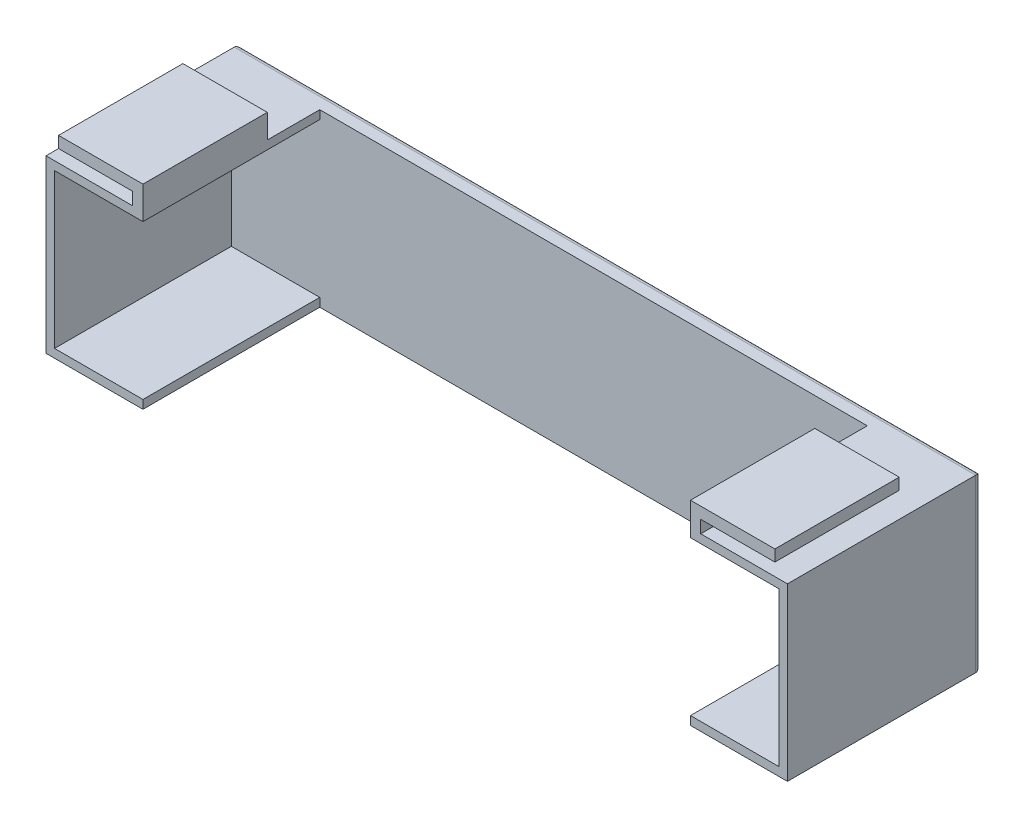
ISO-10303-21;
HEADER;
FILE_DESCRIPTION(('STEP AP214'),'2;1');
FILE_NAME('part.step','',(''),(''),'','','');
FILE_SCHEMA(('AUTOMOTIVE_DESIGN { 1 0 10303 214 1 1 1 1 }'));
ENDSEC;
DATA;
#1=APPLICATION_CONTEXT('core data for automotive mechanical design processes');
#2=APPLICATION_PROTOCOL_DEFINITION('international standard','automotive_design',2000,#1);
#3=PRODUCT_CONTEXT('',#1,'mechanical');
#4=PRODUCT('Part','Part','',(#3));
#5=PRODUCT_RELATED_PRODUCT_CATEGORY('part','',(#4));
#6=PRODUCT_DEFINITION_FORMATION('','',#4);
#7=PRODUCT_DEFINITION_CONTEXT('part definition',#1,'design');
#8=PRODUCT_DEFINITION('design','',#6,#7);
#9=PRODUCT_DEFINITION_SHAPE('','',#8);
#10=(LENGTH_UNIT() NAMED_UNIT(*) SI_UNIT(.MILLI.,.METRE.));
#11=(NAMED_UNIT(*) PLANE_ANGLE_UNIT() SI_UNIT($,.RADIAN.));
#12=(NAMED_UNIT(*) SI_UNIT($,.STERADIAN.) SOLID_ANGLE_UNIT());
#13=UNCERTAINTY_MEASURE_WITH_UNIT(LENGTH_MEASURE(1.E-05),#10,'distance_accuracy_value','');
#14=(GEOMETRIC_REPRESENTATION_CONTEXT(3) GLOBAL_UNCERTAINTY_ASSIGNED_CONTEXT((#13)) GLOBAL_UNIT_ASSIGNED_CONTEXT((#10,
#11,#12)) REPRESENTATION_CONTEXT('',''));
#15=CARTESIAN_POINT('',(0.,0.,0.));
#16=DIRECTION('',(0.,0.,1.));
#17=DIRECTION('',(1.,0.,0.));
#18=AXIS2_PLACEMENT_3D('',#15,#16,#17);
#19=CARTESIAN_POINT('',(0.,30.,1.));
#20=DIRECTION('',(0.,-1.,0.));
#21=DIRECTION('',(0.,0.,-1.));
#22=AXIS2_PLACEMENT_3D('',#19,#20,#21);
#23=PLANE('',#22);
#24=DIRECTION('',(0.,0.,-1.));
#25=VECTOR('',#24,1.);
#26=CARTESIAN_POINT('',(130.,30.,1.));
#27=LINE('',#26,#25);
#28=CARTESIAN_POINT('',(130.,30.,32.));
#29=VERTEX_POINT('',#28);
#30=CARTESIAN_POINT('',(130.,30.,-1.));
#31=VERTEX_POINT('',#30);
#32=EDGE_CURVE('E297',#29,#31,#27,.T.);
#33=ORIENTED_EDGE('',*,*,#32,.T.);
#34=DIRECTION('',(1.,0.,0.));
#35=VECTOR('',#34,1.);
#36=CARTESIAN_POINT('',(0.,30.,-1.));
#37=LINE('',#36,#35);
#38=CARTESIAN_POINT('',(0.,30.,-1.));
#39=VERTEX_POINT('',#38);
#40=EDGE_CURVE('E271',#31,#39,#37,.F.);
#41=ORIENTED_EDGE('',*,*,#40,.T.);
#42=DIRECTION('',(0.,0.,-1.));
#43=VECTOR('',#42,1.);
#44=CARTESIAN_POINT('',(0.,30.,1.));
#45=LINE('',#44,#43);
#46=CARTESIAN_POINT('',(0.,30.,32.));
#47=VERTEX_POINT('',#46);
#48=EDGE_CURVE('E306',#47,#39,#45,.T.);
#49=ORIENTED_EDGE('',*,*,#48,.F.);
#50=DIRECTION('',(-1.,0.,0.));
#51=VECTOR('',#50,1.);
#52=CARTESIAN_POINT('',(17.,30.,32.));
#53=LINE('',#52,#51);
#54=CARTESIAN_POINT('',(15.2,30.,32.));
#55=VERTEX_POINT('',#54);
#56=EDGE_CURVE('E530',#55,#47,#53,.T.);
#57=ORIENTED_EDGE('',*,*,#56,.F.);
#58=DIRECTION('',(0.,0.,1.));
#59=VECTOR('',#58,1.);
#60=CARTESIAN_POINT('',(15.2,30.,32.));
#61=LINE('',#60,#59);
#62=CARTESIAN_POINT('',(15.2,30.,10.2));
#63=VERTEX_POINT('',#62);
#64=EDGE_CURVE('E462',#63,#55,#61,.T.);
#65=ORIENTED_EDGE('',*,*,#64,.F.);
#66=DIRECTION('',(-1.,0.,0.));
#67=VECTOR('',#66,1.);
#68=CARTESIAN_POINT('',(17.,30.,10.2));
#69=LINE('',#68,#67);
#70=CARTESIAN_POINT('',(17.,30.,10.2));
#71=VERTEX_POINT('',#70);
#72=EDGE_CURVE('E454',#71,#63,#69,.T.);
#73=ORIENTED_EDGE('',*,*,#72,.F.);
#74=DIRECTION('',(0.,0.,-1.));
#75=VECTOR('',#74,1.);
#76=CARTESIAN_POINT('',(17.,30.,32.));
#77=LINE('',#76,#75);
#78=CARTESIAN_POINT('',(17.,30.,1.));
#79=VERTEX_POINT('',#78);
#80=EDGE_CURVE('E548',#71,#79,#77,.T.);
#81=ORIENTED_EDGE('',*,*,#80,.T.);
#82=DIRECTION('',(-1.,0.,0.));
#83=VECTOR('',#82,1.);
#84=CARTESIAN_POINT('',(0.,30.,1.));
#85=LINE('',#84,#83);
#86=CARTESIAN_POINT('',(113.,30.,1.));
#87=VERTEX_POINT('',#86);
#88=EDGE_CURVE('E310',#87,#79,#85,.T.);
#89=ORIENTED_EDGE('',*,*,#88,.F.);
#90=DIRECTION('',(0.,0.,-1.));
#91=VECTOR('',#90,1.);
#92=CARTESIAN_POINT('',(113.,30.,32.));
#93=LINE('',#92,#91);
#94=CARTESIAN_POINT('',(113.,30.,10.2));
#95=VERTEX_POINT('',#94);
#96=EDGE_CURVE('E475',#95,#87,#93,.T.);
#97=ORIENTED_EDGE('',*,*,#96,.F.);
#98=DIRECTION('',(-1.,0.,0.));
#99=VECTOR('',#98,1.);
#100=CARTESIAN_POINT('',(113.,30.,10.2));
#101=LINE('',#100,#99);
#102=CARTESIAN_POINT('',(114.8,30.,10.2));
#103=VERTEX_POINT('',#102);
#104=EDGE_CURVE('E450',#103,#95,#101,.T.);
#105=ORIENTED_EDGE('',*,*,#104,.F.);
#106=DIRECTION('',(0.,0.,-1.));
#107=VECTOR('',#106,1.);
#108=CARTESIAN_POINT('',(114.8,30.,32.));
#109=LINE('',#108,#107);
#110=CARTESIAN_POINT('',(114.8,30.,32.));
#111=VERTEX_POINT('',#110);
#112=EDGE_CURVE('E452',#111,#103,#109,.T.);
#113=ORIENTED_EDGE('',*,*,#112,.F.);
#114=DIRECTION('',(-1.,0.,0.));
#115=VECTOR('',#114,1.);
#116=CARTESIAN_POINT('',(130.,30.,32.));
#117=LINE('',#116,#115);
#118=EDGE_CURVE('E305',#29,#111,#117,.T.);
#119=ORIENTED_EDGE('',*,*,#118,.F.);
#120=EDGE_LOOP('',(#33,#41,#49,#57,#65,#73,#81,#89,#97,#105,#113,#119));
#121=FACE_BOUND('',#120,.T.);
#122=ADVANCED_FACE('F47',(#121),#23,.F.);
#123=CARTESIAN_POINT('',(0.,0.,1.));
#124=DIRECTION('',(0.,0.,-1.));
#125=DIRECTION('',(-1.,0.,0.));
#126=AXIS2_PLACEMENT_3D('',#123,#124,#125);
#127=PLANE('',#126);
#128=DIRECTION('',(0.,-1.,0.));
#129=VECTOR('',#128,1.);
#130=CARTESIAN_POINT('',(113.,30.,1.));
#131=LINE('',#130,#129);
#132=CARTESIAN_POINT('',(113.,28.5,1.));
#133=VERTEX_POINT('',#132);
#134=EDGE_CURVE('E513',#87,#133,#131,.T.);
#135=ORIENTED_EDGE('',*,*,#134,.F.);
#136=ORIENTED_EDGE('',*,*,#88,.T.);
#137=DIRECTION('',(0.,1.,0.));
#138=VECTOR('',#137,1.);
#139=CARTESIAN_POINT('',(17.,30.,1.));
#140=LINE('',#139,#138);
#141=CARTESIAN_POINT('',(17.,28.5,1.));
#142=VERTEX_POINT('',#141);
#143=EDGE_CURVE('E533',#142,#79,#140,.T.);
#144=ORIENTED_EDGE('',*,*,#143,.F.);
#145=DIRECTION('',(1.,0.,0.));
#146=VECTOR('',#145,1.);
#147=CARTESIAN_POINT('',(17.,28.5,1.));
#148=LINE('',#147,#146);
#149=CARTESIAN_POINT('',(1.5,28.5,1.));
#150=VERTEX_POINT('',#149);
#151=EDGE_CURVE('E558',#150,#142,#148,.T.);
#152=ORIENTED_EDGE('',*,*,#151,.F.);
#153=DIRECTION('',(0.,1.,0.));
#154=VECTOR('',#153,1.);
#155=CARTESIAN_POINT('',(1.5,28.5,1.));
#156=LINE('',#155,#154);
#157=CARTESIAN_POINT('',(1.5,1.5,1.));
#158=VERTEX_POINT('',#157);
#159=EDGE_CURVE('E554',#158,#150,#156,.T.);
#160=ORIENTED_EDGE('',*,*,#159,.F.);
#161=DIRECTION('',(-1.,0.,0.));
#162=VECTOR('',#161,1.);
#163=CARTESIAN_POINT('',(1.5,1.5,1.));
#164=LINE('',#163,#162);
#165=CARTESIAN_POINT('',(17.,1.5,1.));
#166=VERTEX_POINT('',#165);
#167=EDGE_CURVE('E551',#166,#158,#164,.T.);
#168=ORIENTED_EDGE('',*,*,#167,.F.);
#169=DIRECTION('',(0.,1.,0.));
#170=VECTOR('',#169,1.);
#171=CARTESIAN_POINT('',(17.,1.5,1.));
#172=LINE('',#171,#170);
#173=CARTESIAN_POINT('',(17.,0.,1.));
#174=VERTEX_POINT('',#173);
#175=EDGE_CURVE('E516',#174,#166,#172,.T.);
#176=ORIENTED_EDGE('',*,*,#175,.F.);
#177=DIRECTION('',(1.,0.,0.));
#178=VECTOR('',#177,1.);
#179=CARTESIAN_POINT('',(0.,0.,1.));
#180=LINE('',#179,#178);
#181=CARTESIAN_POINT('',(113.,0.,1.));
#182=VERTEX_POINT('',#181);
#183=EDGE_CURVE('E580',#174,#182,#180,.T.);
#184=ORIENTED_EDGE('',*,*,#183,.T.);
#185=DIRECTION('',(0.,-1.,0.));
#186=VECTOR('',#185,1.);
#187=CARTESIAN_POINT('',(113.,1.5,1.));
#188=LINE('',#187,#186);
#189=CARTESIAN_POINT('',(113.,1.5,1.));
#190=VERTEX_POINT('',#189);
#191=EDGE_CURVE('E496',#190,#182,#188,.T.);
#192=ORIENTED_EDGE('',*,*,#191,.F.);
#193=DIRECTION('',(-1.,0.,0.));
#194=VECTOR('',#193,1.);
#195=CARTESIAN_POINT('',(113.,1.5,1.));
#196=LINE('',#195,#194);
#197=CARTESIAN_POINT('',(128.5,1.50000000000001,1.));
#198=VERTEX_POINT('',#197);
#199=EDGE_CURVE('E500',#198,#190,#196,.T.);
#200=ORIENTED_EDGE('',*,*,#199,.F.);
#201=DIRECTION('',(0.,-1.,0.));
#202=VECTOR('',#201,1.);
#203=CARTESIAN_POINT('',(128.5,1.50000000000001,1.));
#204=LINE('',#203,#202);
#205=CARTESIAN_POINT('',(128.5,28.5,1.));
#206=VERTEX_POINT('',#205);
#207=EDGE_CURVE('E505',#206,#198,#204,.T.);
#208=ORIENTED_EDGE('',*,*,#207,.F.);
#209=DIRECTION('',(1.,0.,0.));
#210=VECTOR('',#209,1.);
#211=CARTESIAN_POINT('',(128.5,28.5,1.));
#212=LINE('',#211,#210);
#213=EDGE_CURVE('E509',#133,#206,#212,.T.);
#214=ORIENTED_EDGE('',*,*,#213,.F.);
#215=EDGE_LOOP('',(#135,#136,#144,#152,#160,#168,#176,#184,#192,#200,#208,#214));
#216=FACE_BOUND('',#215,.T.);
#217=ADVANCED_FACE('F587',(#216),#127,.F.);
#218=CARTESIAN_POINT('',(0.,0.,1.));
#219=DIRECTION('',(1.,0.,0.));
#220=DIRECTION('',(0.,0.,-1.));
#221=AXIS2_PLACEMENT_3D('',#218,#219,#220);
#222=PLANE('',#221);
#223=ORIENTED_EDGE('',*,*,#48,.T.);
#224=DIRECTION('',(0.,1.,0.));
#225=VECTOR('',#224,1.);
#226=CARTESIAN_POINT('',(0.,0.,-1.));
#227=LINE('',#226,#225);
#228=CARTESIAN_POINT('',(0.,0.,-1.));
#229=VERTEX_POINT('',#228);
#230=EDGE_CURVE('E58',#39,#229,#227,.F.);
#231=ORIENTED_EDGE('',*,*,#230,.T.);
#232=DIRECTION('',(0.,0.,-1.));
#233=VECTOR('',#232,1.);
#234=CARTESIAN_POINT('',(0.,0.,1.));
#235=LINE('',#234,#233);
#236=CARTESIAN_POINT('',(0.,0.,32.));
#237=VERTEX_POINT('',#236);
#238=EDGE_CURVE('E308',#237,#229,#235,.T.);
#239=ORIENTED_EDGE('',*,*,#238,.F.);
#240=DIRECTION('',(0.,-1.,0.));
#241=VECTOR('',#240,1.);
#242=CARTESIAN_POINT('',(0.,30.,32.));
#243=LINE('',#242,#241);
#244=EDGE_CURVE('E532',#47,#237,#243,.T.);
#245=ORIENTED_EDGE('',*,*,#244,.F.);
#246=EDGE_LOOP('',(#223,#231,#239,#245));
#247=FACE_BOUND('',#246,.T.);
#248=ADVANCED_FACE('F694',(#247),#222,.F.);
#249=CARTESIAN_POINT('',(0.,0.,1.));
#250=DIRECTION('',(0.,1.,0.));
#251=DIRECTION('',(0.,0.,1.));
#252=AXIS2_PLACEMENT_3D('',#249,#250,#251);
#253=PLANE('',#252);
#254=ORIENTED_EDGE('',*,*,#238,.T.);
#255=DIRECTION('',(-1.,0.,0.));
#256=VECTOR('',#255,1.);
#257=CARTESIAN_POINT('',(130.,0.,-1.));
#258=LINE('',#257,#256);
#259=CARTESIAN_POINT('',(130.,0.,-1.));
#260=VERTEX_POINT('',#259);
#261=EDGE_CURVE('E11',#229,#260,#258,.F.);
#262=ORIENTED_EDGE('',*,*,#261,.T.);
#263=DIRECTION('',(0.,0.,-1.));
#264=VECTOR('',#263,1.);
#265=CARTESIAN_POINT('',(130.,0.,1.));
#266=LINE('',#265,#264);
#267=CARTESIAN_POINT('',(130.,0.,32.));
#268=VERTEX_POINT('',#267);
#269=EDGE_CURVE('E299',#268,#260,#266,.T.);
#270=ORIENTED_EDGE('',*,*,#269,.F.);
#271=DIRECTION('',(1.,0.,0.));
#272=VECTOR('',#271,1.);
#273=CARTESIAN_POINT('',(113.,0.,32.));
#274=LINE('',#273,#272);
#275=CARTESIAN_POINT('',(113.,0.,32.));
#276=VERTEX_POINT('',#275);
#277=EDGE_CURVE('E501',#276,#268,#274,.T.);
#278=ORIENTED_EDGE('',*,*,#277,.F.);
#279=DIRECTION('',(0.,0.,-1.));
#280=VECTOR('',#279,1.);
#281=CARTESIAN_POINT('',(113.,0.,32.));
#282=LINE('',#281,#280);
#283=EDGE_CURVE('E491',#276,#182,#282,.T.);
#284=ORIENTED_EDGE('',*,*,#283,.T.);
#285=ORIENTED_EDGE('',*,*,#183,.F.);
#286=DIRECTION('',(0.,0.,-1.));
#287=VECTOR('',#286,1.);
#288=CARTESIAN_POINT('',(17.,0.,32.));
#289=LINE('',#288,#287);
#290=CARTESIAN_POINT('',(17.,0.,32.));
#291=VERTEX_POINT('',#290);
#292=EDGE_CURVE('E577',#291,#174,#289,.T.);
#293=ORIENTED_EDGE('',*,*,#292,.F.);
#294=DIRECTION('',(1.,0.,0.));
#295=VECTOR('',#294,1.);
#296=CARTESIAN_POINT('',(0.,0.,32.));
#297=LINE('',#296,#295);
#298=EDGE_CURVE('E536',#237,#291,#297,.T.);
#299=ORIENTED_EDGE('',*,*,#298,.F.);
#300=EDGE_LOOP('',(#254,#262,#270,#278,#284,#285,#293,#299));
#301=FACE_BOUND('',#300,.T.);
#302=ADVANCED_FACE('F614',(#301),#253,.F.);
#303=CARTESIAN_POINT('',(130.,0.,1.));
#304=DIRECTION('',(-1.,0.,0.));
#305=DIRECTION('',(0.,0.,1.));
#306=AXIS2_PLACEMENT_3D('',#303,#304,#305);
#307=PLANE('',#306);
#308=ORIENTED_EDGE('',*,*,#269,.T.);
#309=DIRECTION('',(0.,-1.,0.));
#310=VECTOR('',#309,1.);
#311=CARTESIAN_POINT('',(130.,30.,-1.));
#312=LINE('',#311,#310);
#313=EDGE_CURVE('E282',#260,#31,#312,.F.);
#314=ORIENTED_EDGE('',*,*,#313,.T.);
#315=ORIENTED_EDGE('',*,*,#32,.F.);
#316=DIRECTION('',(0.,1.,0.));
#317=VECTOR('',#316,1.);
#318=CARTESIAN_POINT('',(130.,0.,32.));
#319=LINE('',#318,#317);
#320=EDGE_CURVE('E526',#268,#29,#319,.T.);
#321=ORIENTED_EDGE('',*,*,#320,.F.);
#322=EDGE_LOOP('',(#308,#314,#315,#321));
#323=FACE_BOUND('',#322,.T.);
#324=ADVANCED_FACE('F295',(#323),#307,.F.);
#325=CARTESIAN_POINT('',(17.,1.5,32.));
#326=DIRECTION('',(-1.,0.,0.));
#327=DIRECTION('',(0.,0.,1.));
#328=AXIS2_PLACEMENT_3D('',#325,#326,#327);
#329=PLANE('',#328);
#330=ORIENTED_EDGE('',*,*,#175,.T.);
#331=DIRECTION('',(0.,0.,-1.));
#332=VECTOR('',#331,1.);
#333=CARTESIAN_POINT('',(17.,1.5,32.));
#334=LINE('',#333,#332);
#335=CARTESIAN_POINT('',(17.,1.5,32.));
#336=VERTEX_POINT('',#335);
#337=EDGE_CURVE('E574',#336,#166,#334,.T.);
#338=ORIENTED_EDGE('',*,*,#337,.F.);
#339=DIRECTION('',(0.,1.,0.));
#340=VECTOR('',#339,1.);
#341=CARTESIAN_POINT('',(17.,1.5,32.));
#342=LINE('',#341,#340);
#343=EDGE_CURVE('E538',#291,#336,#342,.T.);
#344=ORIENTED_EDGE('',*,*,#343,.F.);
#345=ORIENTED_EDGE('',*,*,#292,.T.);
#346=EDGE_LOOP('',(#330,#338,#344,#345));
#347=FACE_BOUND('',#346,.T.);
#348=ADVANCED_FACE('F609',(#347),#329,.F.);
#349=CARTESIAN_POINT('',(1.5,1.5,32.));
#350=DIRECTION('',(0.,-1.,0.));
#351=DIRECTION('',(1.,0.,0.));
#352=AXIS2_PLACEMENT_3D('',#349,#350,#351);
#353=PLANE('',#352);
#354=ORIENTED_EDGE('',*,*,#167,.T.);
#355=DIRECTION('',(0.,0.,-1.));
#356=VECTOR('',#355,1.);
#357=CARTESIAN_POINT('',(1.5,1.5,32.));
#358=LINE('',#357,#356);
#359=CARTESIAN_POINT('',(1.5,1.5,32.));
#360=VERTEX_POINT('',#359);
#361=EDGE_CURVE('E570',#360,#158,#358,.T.);
#362=ORIENTED_EDGE('',*,*,#361,.F.);
#363=DIRECTION('',(-1.,0.,0.));
#364=VECTOR('',#363,1.);
#365=CARTESIAN_POINT('',(1.5,1.5,32.));
#366=LINE('',#365,#364);
#367=EDGE_CURVE('E540',#336,#360,#366,.T.);
#368=ORIENTED_EDGE('',*,*,#367,.F.);
#369=ORIENTED_EDGE('',*,*,#337,.T.);
#370=EDGE_LOOP('',(#354,#362,#368,#369));
#371=FACE_BOUND('',#370,.T.);
#372=ADVANCED_FACE('F605',(#371),#353,.F.);
#373=CARTESIAN_POINT('',(1.5,28.5,32.));
#374=DIRECTION('',(-1.,0.,0.));
#375=DIRECTION('',(0.,-1.,0.));
#376=AXIS2_PLACEMENT_3D('',#373,#374,#375);
#377=PLANE('',#376);
#378=ORIENTED_EDGE('',*,*,#159,.T.);
#379=DIRECTION('',(0.,0.,-1.));
#380=VECTOR('',#379,1.);
#381=CARTESIAN_POINT('',(1.5,28.5,32.));
#382=LINE('',#381,#380);
#383=CARTESIAN_POINT('',(1.5,28.5,32.));
#384=VERTEX_POINT('',#383);
#385=EDGE_CURVE('E567',#384,#150,#382,.T.);
#386=ORIENTED_EDGE('',*,*,#385,.F.);
#387=DIRECTION('',(0.,1.,0.));
#388=VECTOR('',#387,1.);
#389=CARTESIAN_POINT('',(1.5,28.5,32.));
#390=LINE('',#389,#388);
#391=EDGE_CURVE('E542',#360,#384,#390,.T.);
#392=ORIENTED_EDGE('',*,*,#391,.F.);
#393=ORIENTED_EDGE('',*,*,#361,.T.);
#394=EDGE_LOOP('',(#378,#386,#392,#393));
#395=FACE_BOUND('',#394,.T.);
#396=ADVANCED_FACE('F600',(#395),#377,.F.);
#397=CARTESIAN_POINT('',(17.,28.5,32.));
#398=DIRECTION('',(0.,1.,0.));
#399=DIRECTION('',(-1.,0.,0.));
#400=AXIS2_PLACEMENT_3D('',#397,#398,#399);
#401=PLANE('',#400);
#402=ORIENTED_EDGE('',*,*,#151,.T.);
#403=DIRECTION('',(0.,0.,-1.));
#404=VECTOR('',#403,1.);
#405=CARTESIAN_POINT('',(17.,28.5,32.));
#406=LINE('',#405,#404);
#407=CARTESIAN_POINT('',(17.,28.5,32.));
#408=VERTEX_POINT('',#407);
#409=EDGE_CURVE('E564',#408,#142,#406,.T.);
#410=ORIENTED_EDGE('',*,*,#409,.F.);
#411=DIRECTION('',(1.,0.,0.));
#412=VECTOR('',#411,1.);
#413=CARTESIAN_POINT('',(17.,28.5,32.));
#414=LINE('',#413,#412);
#415=EDGE_CURVE('E544',#384,#408,#414,.T.);
#416=ORIENTED_EDGE('',*,*,#415,.F.);
#417=ORIENTED_EDGE('',*,*,#385,.T.);
#418=EDGE_LOOP('',(#402,#410,#416,#417));
#419=FACE_BOUND('',#418,.T.);
#420=ADVANCED_FACE('F597',(#419),#401,.F.);
#421=CARTESIAN_POINT('',(17.,30.,32.));
#422=DIRECTION('',(-1.,0.,0.));
#423=DIRECTION('',(0.,0.,1.));
#424=AXIS2_PLACEMENT_3D('',#421,#422,#423);
#425=PLANE('',#424);
#426=ORIENTED_EDGE('',*,*,#143,.T.);
#427=ORIENTED_EDGE('',*,*,#80,.F.);
#428=DIRECTION('',(0.,-1.,0.));
#429=VECTOR('',#428,1.);
#430=CARTESIAN_POINT('',(17.,32.2,10.2));
#431=LINE('',#430,#429);
#432=CARTESIAN_POINT('',(17.,34.2,10.2));
#433=VERTEX_POINT('',#432);
#434=EDGE_CURVE('E472',#433,#71,#431,.T.);
#435=ORIENTED_EDGE('',*,*,#434,.F.);
#436=DIRECTION('',(0.,0.,-1.));
#437=VECTOR('',#436,1.);
#438=CARTESIAN_POINT('',(17.,34.2,32.));
#439=LINE('',#438,#437);
#440=CARTESIAN_POINT('',(17.,34.2,32.));
#441=VERTEX_POINT('',#440);
#442=EDGE_CURVE('E419',#441,#433,#439,.T.);
#443=ORIENTED_EDGE('',*,*,#442,.F.);
#444=DIRECTION('',(0.,1.,0.));
#445=VECTOR('',#444,1.);
#446=CARTESIAN_POINT('',(17.,30.,32.));
#447=LINE('',#446,#445);
#448=EDGE_CURVE('E546',#408,#441,#447,.T.);
#449=ORIENTED_EDGE('',*,*,#448,.F.);
#450=ORIENTED_EDGE('',*,*,#409,.T.);
#451=EDGE_LOOP('',(#426,#427,#435,#443,#449,#450));
#452=FACE_BOUND('',#451,.T.);
#453=ADVANCED_FACE('F591',(#452),#425,.F.);
#454=CARTESIAN_POINT('',(0.,0.,32.));
#455=DIRECTION('',(0.,0.,1.));
#456=DIRECTION('',(1.,0.,0.));
#457=AXIS2_PLACEMENT_3D('',#454,#455,#456);
#458=PLANE('',#457);
#459=ORIENTED_EDGE('',*,*,#448,.T.);
#460=DIRECTION('',(1.,0.,0.));
#461=VECTOR('',#460,1.);
#462=CARTESIAN_POINT('',(17.,34.2,32.));
#463=LINE('',#462,#461);
#464=CARTESIAN_POINT('',(2.2,34.2,32.));
#465=VERTEX_POINT('',#464);
#466=EDGE_CURVE('E427',#465,#441,#463,.T.);
#467=ORIENTED_EDGE('',*,*,#466,.F.);
#468=DIRECTION('',(0.,-1.,0.));
#469=VECTOR('',#468,1.);
#470=CARTESIAN_POINT('',(2.2,34.2,32.));
#471=LINE('',#470,#469);
#472=CARTESIAN_POINT('',(2.2,32.2,32.));
#473=VERTEX_POINT('',#472);
#474=EDGE_CURVE('E430',#465,#473,#471,.T.);
#475=ORIENTED_EDGE('',*,*,#474,.T.);
#476=DIRECTION('',(1.,0.,0.));
#477=VECTOR('',#476,1.);
#478=CARTESIAN_POINT('',(17.,32.2,32.));
#479=LINE('',#478,#477);
#480=CARTESIAN_POINT('',(15.2,32.2,32.));
#481=VERTEX_POINT('',#480);
#482=EDGE_CURVE('E423',#473,#481,#479,.T.);
#483=ORIENTED_EDGE('',*,*,#482,.T.);
#484=DIRECTION('',(0.,-1.,0.));
#485=VECTOR('',#484,1.);
#486=CARTESIAN_POINT('',(15.2,32.2,32.));
#487=LINE('',#486,#485);
#488=EDGE_CURVE('E461',#481,#55,#487,.T.);
#489=ORIENTED_EDGE('',*,*,#488,.T.);
#490=ORIENTED_EDGE('',*,*,#56,.T.);
#491=ORIENTED_EDGE('',*,*,#244,.T.);
#492=ORIENTED_EDGE('',*,*,#298,.T.);
#493=ORIENTED_EDGE('',*,*,#343,.T.);
#494=ORIENTED_EDGE('',*,*,#367,.T.);
#495=ORIENTED_EDGE('',*,*,#391,.T.);
#496=ORIENTED_EDGE('',*,*,#415,.T.);
#497=EDGE_LOOP('',(#459,#467,#475,#483,#489,#490,#491,#492,#493,#494,#495,#496));
#498=FACE_BOUND('',#497,.T.);
#499=ADVANCED_FACE('F929',(#498),#458,.T.);
#500=CARTESIAN_POINT('',(113.,30.,32.));
#501=DIRECTION('',(1.,0.,0.));
#502=DIRECTION('',(0.,0.,-1.));
#503=AXIS2_PLACEMENT_3D('',#500,#501,#502);
#504=PLANE('',#503);
#505=ORIENTED_EDGE('',*,*,#134,.T.);
#506=DIRECTION('',(0.,0.,-1.));
#507=VECTOR('',#506,1.);
#508=CARTESIAN_POINT('',(113.,28.5,32.));
#509=LINE('',#508,#507);
#510=CARTESIAN_POINT('',(113.,28.5,32.));
#511=VERTEX_POINT('',#510);
#512=EDGE_CURVE('E477',#511,#133,#509,.T.);
#513=ORIENTED_EDGE('',*,*,#512,.F.);
#514=DIRECTION('',(0.,-1.,0.));
#515=VECTOR('',#514,1.);
#516=CARTESIAN_POINT('',(113.,30.,32.));
#517=LINE('',#516,#515);
#518=CARTESIAN_POINT('',(113.,34.2,32.));
#519=VERTEX_POINT('',#518);
#520=EDGE_CURVE('E113',#519,#511,#517,.T.);
#521=ORIENTED_EDGE('',*,*,#520,.F.);
#522=DIRECTION('',(0.,0.,1.));
#523=VECTOR('',#522,1.);
#524=CARTESIAN_POINT('',(113.,34.2,32.));
#525=LINE('',#524,#523);
#526=CARTESIAN_POINT('',(113.,34.2,10.2));
#527=VERTEX_POINT('',#526);
#528=EDGE_CURVE('E397',#527,#519,#525,.T.);
#529=ORIENTED_EDGE('',*,*,#528,.F.);
#530=DIRECTION('',(0.,-1.,0.));
#531=VECTOR('',#530,1.);
#532=CARTESIAN_POINT('',(113.,32.2,10.2));
#533=LINE('',#532,#531);
#534=EDGE_CURVE('E446',#527,#95,#533,.T.);
#535=ORIENTED_EDGE('',*,*,#534,.T.);
#536=ORIENTED_EDGE('',*,*,#96,.T.);
#537=EDGE_LOOP('',(#505,#513,#521,#529,#535,#536));
#538=FACE_BOUND('',#537,.T.);
#539=ADVANCED_FACE('F632',(#538),#504,.F.);
#540=CARTESIAN_POINT('',(128.5,28.5,32.));
#541=DIRECTION('',(0.,1.,0.));
#542=DIRECTION('',(-1.,0.,0.));
#543=AXIS2_PLACEMENT_3D('',#540,#541,#542);
#544=PLANE('',#543);
#545=ORIENTED_EDGE('',*,*,#213,.T.);
#546=DIRECTION('',(0.,0.,-1.));
#547=VECTOR('',#546,1.);
#548=CARTESIAN_POINT('',(128.5,28.5,32.));
#549=LINE('',#548,#547);
#550=CARTESIAN_POINT('',(128.5,28.5,32.));
#551=VERTEX_POINT('',#550);
#552=EDGE_CURVE('E481',#551,#206,#549,.T.);
#553=ORIENTED_EDGE('',*,*,#552,.F.);
#554=DIRECTION('',(1.,0.,0.));
#555=VECTOR('',#554,1.);
#556=CARTESIAN_POINT('',(128.5,28.5,32.));
#557=LINE('',#556,#555);
#558=EDGE_CURVE('E522',#511,#551,#557,.T.);
#559=ORIENTED_EDGE('',*,*,#558,.F.);
#560=ORIENTED_EDGE('',*,*,#512,.T.);
#561=EDGE_LOOP('',(#545,#553,#559,#560));
#562=FACE_BOUND('',#561,.T.);
#563=ADVANCED_FACE('F631',(#562),#544,.F.);
#564=CARTESIAN_POINT('',(128.5,1.50000000000001,32.));
#565=DIRECTION('',(1.,0.,0.));
#566=DIRECTION('',(0.,0.,-1.));
#567=AXIS2_PLACEMENT_3D('',#564,#565,#566);
#568=PLANE('',#567);
#569=ORIENTED_EDGE('',*,*,#207,.T.);
#570=DIRECTION('',(0.,0.,-1.));
#571=VECTOR('',#570,1.);
#572=CARTESIAN_POINT('',(128.5,1.50000000000001,32.));
#573=LINE('',#572,#571);
#574=CARTESIAN_POINT('',(128.5,1.50000000000001,32.));
#575=VERTEX_POINT('',#574);
#576=EDGE_CURVE('E484',#575,#198,#573,.T.);
#577=ORIENTED_EDGE('',*,*,#576,.F.);
#578=DIRECTION('',(0.,-1.,0.));
#579=VECTOR('',#578,1.);
#580=CARTESIAN_POINT('',(128.5,1.50000000000001,32.));
#581=LINE('',#580,#579);
#582=EDGE_CURVE('E520',#551,#575,#581,.T.);
#583=ORIENTED_EDGE('',*,*,#582,.F.);
#584=ORIENTED_EDGE('',*,*,#552,.T.);
#585=EDGE_LOOP('',(#569,#577,#583,#584));
#586=FACE_BOUND('',#585,.T.);
#587=ADVANCED_FACE('F626',(#586),#568,.F.);
#588=CARTESIAN_POINT('',(113.,1.5,32.));
#589=DIRECTION('',(0.,-1.,0.));
#590=DIRECTION('',(1.,0.,0.));
#591=AXIS2_PLACEMENT_3D('',#588,#589,#590);
#592=PLANE('',#591);
#593=ORIENTED_EDGE('',*,*,#199,.T.);
#594=DIRECTION('',(0.,0.,-1.));
#595=VECTOR('',#594,1.);
#596=CARTESIAN_POINT('',(113.,1.5,32.));
#597=LINE('',#596,#595);
#598=CARTESIAN_POINT('',(113.,1.5,32.));
#599=VERTEX_POINT('',#598);
#600=EDGE_CURVE('E488',#599,#190,#597,.T.);
#601=ORIENTED_EDGE('',*,*,#600,.F.);
#602=DIRECTION('',(-1.,0.,0.));
#603=VECTOR('',#602,1.);
#604=CARTESIAN_POINT('',(113.,1.5,32.));
#605=LINE('',#604,#603);
#606=EDGE_CURVE('E518',#575,#599,#605,.T.);
#607=ORIENTED_EDGE('',*,*,#606,.F.);
#608=ORIENTED_EDGE('',*,*,#576,.T.);
#609=EDGE_LOOP('',(#593,#601,#607,#608));
#610=FACE_BOUND('',#609,.T.);
#611=ADVANCED_FACE('F623',(#610),#592,.F.);
#612=CARTESIAN_POINT('',(113.,1.5,32.));
#613=DIRECTION('',(1.,0.,0.));
#614=DIRECTION('',(0.,0.,-1.));
#615=AXIS2_PLACEMENT_3D('',#612,#613,#614);
#616=PLANE('',#615);
#617=ORIENTED_EDGE('',*,*,#191,.T.);
#618=ORIENTED_EDGE('',*,*,#283,.F.);
#619=DIRECTION('',(0.,-1.,0.));
#620=VECTOR('',#619,1.);
#621=CARTESIAN_POINT('',(113.,1.5,32.));
#622=LINE('',#621,#620);
#623=EDGE_CURVE('E495',#599,#276,#622,.T.);
#624=ORIENTED_EDGE('',*,*,#623,.F.);
#625=ORIENTED_EDGE('',*,*,#600,.T.);
#626=EDGE_LOOP('',(#617,#618,#624,#625));
#627=FACE_BOUND('',#626,.T.);
#628=ADVANCED_FACE('F618',(#627),#616,.F.);
#629=CARTESIAN_POINT('',(0.,0.,32.));
#630=DIRECTION('',(0.,0.,1.));
#631=DIRECTION('',(1.,0.,0.));
#632=AXIS2_PLACEMENT_3D('',#629,#630,#631);
#633=PLANE('',#632);
#634=ORIENTED_EDGE('',*,*,#277,.T.);
#635=ORIENTED_EDGE('',*,*,#320,.T.);
#636=ORIENTED_EDGE('',*,*,#118,.T.);
#637=DIRECTION('',(0.,-1.,0.));
#638=VECTOR('',#637,1.);
#639=CARTESIAN_POINT('',(114.8,32.2,32.));
#640=LINE('',#639,#638);
#641=CARTESIAN_POINT('',(114.8,32.2,32.));
#642=VERTEX_POINT('',#641);
#643=EDGE_CURVE('E441',#642,#111,#640,.T.);
#644=ORIENTED_EDGE('',*,*,#643,.F.);
#645=DIRECTION('',(1.,0.,0.));
#646=VECTOR('',#645,1.);
#647=CARTESIAN_POINT('',(113.,32.2,32.));
#648=LINE('',#647,#646);
#649=CARTESIAN_POINT('',(127.8,32.2,32.));
#650=VERTEX_POINT('',#649);
#651=EDGE_CURVE('E406',#642,#650,#648,.T.);
#652=ORIENTED_EDGE('',*,*,#651,.T.);
#653=DIRECTION('',(0.,-1.,0.));
#654=VECTOR('',#653,1.);
#655=CARTESIAN_POINT('',(127.8,34.2,32.));
#656=LINE('',#655,#654);
#657=CARTESIAN_POINT('',(127.8,34.2,32.));
#658=VERTEX_POINT('',#657);
#659=EDGE_CURVE('E388',#658,#650,#656,.T.);
#660=ORIENTED_EDGE('',*,*,#659,.F.);
#661=DIRECTION('',(1.,0.,0.));
#662=VECTOR('',#661,1.);
#663=CARTESIAN_POINT('',(113.,34.2,32.));
#664=LINE('',#663,#662);
#665=EDGE_CURVE('E404',#519,#658,#664,.T.);
#666=ORIENTED_EDGE('',*,*,#665,.F.);
#667=ORIENTED_EDGE('',*,*,#520,.T.);
#668=ORIENTED_EDGE('',*,*,#558,.T.);
#669=ORIENTED_EDGE('',*,*,#582,.T.);
#670=ORIENTED_EDGE('',*,*,#606,.T.);
#671=ORIENTED_EDGE('',*,*,#623,.T.);
#672=EDGE_LOOP('',(#634,#635,#636,#644,#652,#660,#666,#667,#668,#669,#670,#671));
#673=FACE_BOUND('',#672,.T.);
#674=ADVANCED_FACE('F646',(#673),#633,.T.);
#675=CARTESIAN_POINT('',(17.,32.2,10.2));
#676=DIRECTION('',(0.,0.,1.));
#677=DIRECTION('',(1.,0.,0.));
#678=AXIS2_PLACEMENT_3D('',#675,#676,#677);
#679=PLANE('',#678);
#680=ORIENTED_EDGE('',*,*,#72,.T.);
#681=DIRECTION('',(0.,-1.,0.));
#682=VECTOR('',#681,1.);
#683=CARTESIAN_POINT('',(15.2,32.2,10.2));
#684=LINE('',#683,#682);
#685=CARTESIAN_POINT('',(15.2,32.2,10.2));
#686=VERTEX_POINT('',#685);
#687=EDGE_CURVE('E469',#686,#63,#684,.T.);
#688=ORIENTED_EDGE('',*,*,#687,.F.);
#689=DIRECTION('',(-1.,0.,0.));
#690=VECTOR('',#689,1.);
#691=CARTESIAN_POINT('',(17.,32.2,10.2));
#692=LINE('',#691,#690);
#693=CARTESIAN_POINT('',(2.2,32.2,10.2));
#694=VERTEX_POINT('',#693);
#695=EDGE_CURVE('E409',#686,#694,#692,.T.);
#696=ORIENTED_EDGE('',*,*,#695,.T.);
#697=DIRECTION('',(0.,-1.,0.));
#698=VECTOR('',#697,1.);
#699=CARTESIAN_POINT('',(2.2,34.2,10.2));
#700=LINE('',#699,#698);
#701=CARTESIAN_POINT('',(2.2,34.2,10.2));
#702=VERTEX_POINT('',#701);
#703=EDGE_CURVE('E438',#702,#694,#700,.T.);
#704=ORIENTED_EDGE('',*,*,#703,.F.);
#705=DIRECTION('',(-1.,0.,0.));
#706=VECTOR('',#705,1.);
#707=CARTESIAN_POINT('',(17.,34.2,10.2));
#708=LINE('',#707,#706);
#709=EDGE_CURVE('E422',#433,#702,#708,.T.);
#710=ORIENTED_EDGE('',*,*,#709,.F.);
#711=ORIENTED_EDGE('',*,*,#434,.T.);
#712=EDGE_LOOP('',(#680,#688,#696,#704,#710,#711));
#713=FACE_BOUND('',#712,.T.);
#714=ADVANCED_FACE('F868',(#713),#679,.F.);
#715=CARTESIAN_POINT('',(15.2,32.2,32.));
#716=DIRECTION('',(1.,0.,0.));
#717=DIRECTION('',(0.,0.,-1.));
#718=AXIS2_PLACEMENT_3D('',#715,#716,#717);
#719=PLANE('',#718);
#720=ORIENTED_EDGE('',*,*,#64,.T.);
#721=ORIENTED_EDGE('',*,*,#488,.F.);
#722=DIRECTION('',(0.,0.,1.));
#723=VECTOR('',#722,1.);
#724=CARTESIAN_POINT('',(15.2,32.2,32.));
#725=LINE('',#724,#723);
#726=EDGE_CURVE('E458',#686,#481,#725,.T.);
#727=ORIENTED_EDGE('',*,*,#726,.F.);
#728=ORIENTED_EDGE('',*,*,#687,.T.);
#729=EDGE_LOOP('',(#720,#721,#727,#728));
#730=FACE_BOUND('',#729,.T.);
#731=ADVANCED_FACE('F860',(#730),#719,.F.);
#732=CARTESIAN_POINT('',(114.8,32.2,32.));
#733=DIRECTION('',(-1.,0.,0.));
#734=DIRECTION('',(0.,0.,1.));
#735=AXIS2_PLACEMENT_3D('',#732,#733,#734);
#736=PLANE('',#735);
#737=ORIENTED_EDGE('',*,*,#112,.T.);
#738=DIRECTION('',(0.,-1.,0.));
#739=VECTOR('',#738,1.);
#740=CARTESIAN_POINT('',(114.8,32.2,10.2));
#741=LINE('',#740,#739);
#742=CARTESIAN_POINT('',(114.8,32.2,10.2));
#743=VERTEX_POINT('',#742);
#744=EDGE_CURVE('E443',#743,#103,#741,.T.);
#745=ORIENTED_EDGE('',*,*,#744,.F.);
#746=DIRECTION('',(0.,0.,-1.));
#747=VECTOR('',#746,1.);
#748=CARTESIAN_POINT('',(114.8,32.2,32.));
#749=LINE('',#748,#747);
#750=EDGE_CURVE('E449',#642,#743,#749,.T.);
#751=ORIENTED_EDGE('',*,*,#750,.F.);
#752=ORIENTED_EDGE('',*,*,#643,.T.);
#753=EDGE_LOOP('',(#737,#745,#751,#752));
#754=FACE_BOUND('',#753,.T.);
#755=ADVANCED_FACE('F639',(#754),#736,.F.);
#756=CARTESIAN_POINT('',(113.,32.2,10.2));
#757=DIRECTION('',(0.,0.,1.));
#758=DIRECTION('',(1.,0.,0.));
#759=AXIS2_PLACEMENT_3D('',#756,#757,#758);
#760=PLANE('',#759);
#761=ORIENTED_EDGE('',*,*,#104,.T.);
#762=ORIENTED_EDGE('',*,*,#534,.F.);
#763=DIRECTION('',(-1.,0.,0.));
#764=VECTOR('',#763,1.);
#765=CARTESIAN_POINT('',(113.,34.2,10.2));
#766=LINE('',#765,#764);
#767=CARTESIAN_POINT('',(127.8,34.2,10.2));
#768=VERTEX_POINT('',#767);
#769=EDGE_CURVE('E412',#768,#527,#766,.T.);
#770=ORIENTED_EDGE('',*,*,#769,.F.);
#771=DIRECTION('',(0.,-1.,0.));
#772=VECTOR('',#771,1.);
#773=CARTESIAN_POINT('',(127.8,34.2,10.2));
#774=LINE('',#773,#772);
#775=CARTESIAN_POINT('',(127.8,32.2,10.2));
#776=VERTEX_POINT('',#775);
#777=EDGE_CURVE('E391',#768,#776,#774,.T.);
#778=ORIENTED_EDGE('',*,*,#777,.T.);
#779=DIRECTION('',(-1.,0.,0.));
#780=VECTOR('',#779,1.);
#781=CARTESIAN_POINT('',(113.,32.2,10.2));
#782=LINE('',#781,#780);
#783=EDGE_CURVE('E400',#776,#743,#782,.T.);
#784=ORIENTED_EDGE('',*,*,#783,.T.);
#785=ORIENTED_EDGE('',*,*,#744,.T.);
#786=EDGE_LOOP('',(#761,#762,#770,#778,#784,#785));
#787=FACE_BOUND('',#786,.T.);
#788=ADVANCED_FACE('F635',(#787),#760,.F.);
#789=CARTESIAN_POINT('',(0.,32.2,0.));
#790=DIRECTION('',(0.,1.,0.));
#791=DIRECTION('',(0.,0.,1.));
#792=AXIS2_PLACEMENT_3D('',#789,#790,#791);
#793=PLANE('',#792);
#794=ORIENTED_EDGE('',*,*,#695,.F.);
#795=ORIENTED_EDGE('',*,*,#726,.T.);
#796=ORIENTED_EDGE('',*,*,#482,.F.);
#797=DIRECTION('',(0.,0.,1.));
#798=VECTOR('',#797,1.);
#799=CARTESIAN_POINT('',(2.2,32.2,32.));
#800=LINE('',#799,#798);
#801=EDGE_CURVE('E432',#694,#473,#800,.T.);
#802=ORIENTED_EDGE('',*,*,#801,.F.);
#803=EDGE_LOOP('',(#794,#795,#796,#802));
#804=FACE_BOUND('',#803,.T.);
#805=ADVANCED_FACE('F834',(#804),#793,.F.);
#806=CARTESIAN_POINT('',(2.2,34.2,32.));
#807=DIRECTION('',(1.,0.,0.));
#808=DIRECTION('',(0.,0.,-1.));
#809=AXIS2_PLACEMENT_3D('',#806,#807,#808);
#810=PLANE('',#809);
#811=ORIENTED_EDGE('',*,*,#801,.T.);
#812=ORIENTED_EDGE('',*,*,#474,.F.);
#813=DIRECTION('',(0.,0.,1.));
#814=VECTOR('',#813,1.);
#815=CARTESIAN_POINT('',(2.2,34.2,32.));
#816=LINE('',#815,#814);
#817=EDGE_CURVE('E425',#702,#465,#816,.T.);
#818=ORIENTED_EDGE('',*,*,#817,.F.);
#819=ORIENTED_EDGE('',*,*,#703,.T.);
#820=EDGE_LOOP('',(#811,#812,#818,#819));
#821=FACE_BOUND('',#820,.T.);
#822=ADVANCED_FACE('F825',(#821),#810,.F.);
#823=CARTESIAN_POINT('',(0.,34.2,0.));
#824=DIRECTION('',(0.,1.,0.));
#825=DIRECTION('',(0.,0.,1.));
#826=AXIS2_PLACEMENT_3D('',#823,#824,#825);
#827=PLANE('',#826);
#828=ORIENTED_EDGE('',*,*,#442,.T.);
#829=ORIENTED_EDGE('',*,*,#709,.T.);
#830=ORIENTED_EDGE('',*,*,#817,.T.);
#831=ORIENTED_EDGE('',*,*,#466,.T.);
#832=EDGE_LOOP('',(#828,#829,#830,#831));
#833=FACE_BOUND('',#832,.T.);
#834=ADVANCED_FACE('F816',(#833),#827,.T.);
#835=CARTESIAN_POINT('',(0.,32.2,0.));
#836=DIRECTION('',(0.,1.,0.));
#837=DIRECTION('',(0.,0.,1.));
#838=AXIS2_PLACEMENT_3D('',#835,#836,#837);
#839=PLANE('',#838);
#840=ORIENTED_EDGE('',*,*,#651,.F.);
#841=ORIENTED_EDGE('',*,*,#750,.T.);
#842=ORIENTED_EDGE('',*,*,#783,.F.);
#843=DIRECTION('',(0.,0.,-1.));
#844=VECTOR('',#843,1.);
#845=CARTESIAN_POINT('',(127.8,32.2,32.));
#846=LINE('',#845,#844);
#847=EDGE_CURVE('E403',#650,#776,#846,.T.);
#848=ORIENTED_EDGE('',*,*,#847,.F.);
#849=EDGE_LOOP('',(#840,#841,#842,#848));
#850=FACE_BOUND('',#849,.T.);
#851=ADVANCED_FACE('F643',(#850),#839,.F.);
#852=CARTESIAN_POINT('',(127.8,34.2,32.));
#853=DIRECTION('',(-1.,0.,0.));
#854=DIRECTION('',(0.,0.,1.));
#855=AXIS2_PLACEMENT_3D('',#852,#853,#854);
#856=PLANE('',#855);
#857=ORIENTED_EDGE('',*,*,#847,.T.);
#858=ORIENTED_EDGE('',*,*,#777,.F.);
#859=DIRECTION('',(0.,0.,-1.));
#860=VECTOR('',#859,1.);
#861=CARTESIAN_POINT('',(127.8,34.2,32.));
#862=LINE('',#861,#860);
#863=EDGE_CURVE('E415',#658,#768,#862,.T.);
#864=ORIENTED_EDGE('',*,*,#863,.F.);
#865=ORIENTED_EDGE('',*,*,#659,.T.);
#866=EDGE_LOOP('',(#857,#858,#864,#865));
#867=FACE_BOUND('',#866,.T.);
#868=ADVANCED_FACE('F649',(#867),#856,.F.);
#869=CARTESIAN_POINT('',(0.,34.2,0.));
#870=DIRECTION('',(0.,1.,0.));
#871=DIRECTION('',(0.,0.,1.));
#872=AXIS2_PLACEMENT_3D('',#869,#870,#871);
#873=PLANE('',#872);
#874=ORIENTED_EDGE('',*,*,#665,.T.);
#875=ORIENTED_EDGE('',*,*,#863,.T.);
#876=ORIENTED_EDGE('',*,*,#769,.T.);
#877=ORIENTED_EDGE('',*,*,#528,.T.);
#878=EDGE_LOOP('',(#874,#875,#876,#877));
#879=FACE_BOUND('',#878,.T.);
#880=ADVANCED_FACE('F651',(#879),#873,.T.);
#881=CARTESIAN_POINT('',(0.,0.,0.));
#882=DIRECTION('',(0.,0.,-1.));
#883=DIRECTION('',(-1.,0.,0.));
#884=AXIS2_PLACEMENT_3D('',#881,#882,#883);
#885=PLANE('',#884);
#886=DIRECTION('',(0.,1.,0.));
#887=VECTOR('',#886,1.);
#888=CARTESIAN_POINT('',(3.,28.,0.));
#889=LINE('',#888,#887);
#890=CARTESIAN_POINT('',(3.,3.,0.));
#891=VERTEX_POINT('',#890);
#892=CARTESIAN_POINT('',(3.,27.,0.));
#893=VERTEX_POINT('',#892);
#894=EDGE_CURVE('E322',#891,#893,#889,.T.);
#895=ORIENTED_EDGE('',*,*,#894,.T.);
#896=DIRECTION('',(1.,0.,0.));
#897=VECTOR('',#896,1.);
#898=CARTESIAN_POINT('',(128.,27.,0.));
#899=LINE('',#898,#897);
#900=CARTESIAN_POINT('',(127.,27.,0.));
#901=VERTEX_POINT('',#900);
#902=EDGE_CURVE('E300',#893,#901,#899,.T.);
#903=ORIENTED_EDGE('',*,*,#902,.T.);
#904=DIRECTION('',(0.,-1.,0.));
#905=VECTOR('',#904,1.);
#906=CARTESIAN_POINT('',(127.,2.,0.));
#907=LINE('',#906,#905);
#908=CARTESIAN_POINT('',(127.,3.,0.));
#909=VERTEX_POINT('',#908);
#910=EDGE_CURVE('E316',#901,#909,#907,.T.);
#911=ORIENTED_EDGE('',*,*,#910,.T.);
#912=DIRECTION('',(-1.,0.,0.));
#913=VECTOR('',#912,1.);
#914=CARTESIAN_POINT('',(2.,3.,0.));
#915=LINE('',#914,#913);
#916=EDGE_CURVE('E319',#909,#891,#915,.T.);
#917=ORIENTED_EDGE('',*,*,#916,.T.);
#918=EDGE_LOOP('',(#895,#903,#911,#917));
#919=FACE_BOUND('',#918,.T.);
#920=ADVANCED_FACE('F679',(#919),#885,.T.);
#921=CARTESIAN_POINT('',(0.,1.,-1.));
#922=DIRECTION('',(1.,0.,0.));
#923=DIRECTION('',(0.,0.,-1.));
#924=AXIS2_PLACEMENT_3D('',#921,#922,#923);
#925=CYLINDRICAL_SURFACE('',#924,1.);
#926=CARTESIAN_POINT('',(129.,1.,-1.));
#927=DIRECTION('',(0.707106781186547,0.707106781186547,0.));
#928=DIRECTION('',(0.707106781186547,-0.707106781186547,0.));
#929=AXIS2_PLACEMENT_3D('',#926,#927,#928);
#930=ELLIPSE('',#929,1.41421356237309,1.);
#931=CARTESIAN_POINT('',(129.,1.,-2.));
#932=VERTEX_POINT('',#931);
#933=EDGE_CURVE('E291',#260,#932,#930,.T.);
#934=ORIENTED_EDGE('',*,*,#933,.F.);
#935=ORIENTED_EDGE('',*,*,#261,.F.);
#936=CARTESIAN_POINT('',(1.,1.,-1.));
#937=DIRECTION('',(0.707106781186547,-0.707106781186547,0.));
#938=DIRECTION('',(0.707106781186547,0.707106781186547,0.));
#939=AXIS2_PLACEMENT_3D('',#936,#937,#938);
#940=ELLIPSE('',#939,1.41421356237309,1.);
#941=CARTESIAN_POINT('',(1.,1.,-2.));
#942=VERTEX_POINT('',#941);
#943=EDGE_CURVE('E51',#942,#229,#940,.F.);
#944=ORIENTED_EDGE('',*,*,#943,.F.);
#945=DIRECTION('',(-1.,0.,0.));
#946=VECTOR('',#945,1.);
#947=CARTESIAN_POINT('',(0.,1.,-2.));
#948=LINE('',#947,#946);
#949=EDGE_CURVE('E100',#932,#942,#948,.T.);
#950=ORIENTED_EDGE('',*,*,#949,.F.);
#951=EDGE_LOOP('',(#934,#935,#944,#950));
#952=FACE_BOUND('',#951,.T.);
#953=ADVANCED_FACE('F49',(#952),#925,.T.);
#954=CARTESIAN_POINT('',(1.,0.,-1.));
#955=DIRECTION('',(0.,-1.,0.));
#956=DIRECTION('',(0.,0.,-1.));
#957=AXIS2_PLACEMENT_3D('',#954,#955,#956);
#958=CYLINDRICAL_SURFACE('',#957,1.);
#959=ORIENTED_EDGE('',*,*,#943,.T.);
#960=ORIENTED_EDGE('',*,*,#230,.F.);
#961=CARTESIAN_POINT('',(1.,29.,-1.));
#962=DIRECTION('',(-0.707106781186547,-0.707106781186547,0.));
#963=DIRECTION('',(0.707106781186547,-0.707106781186547,0.));
#964=AXIS2_PLACEMENT_3D('',#961,#962,#963);
#965=ELLIPSE('',#964,1.41421356237309,1.);
#966=CARTESIAN_POINT('',(1.,29.,-2.));
#967=VERTEX_POINT('',#966);
#968=EDGE_CURVE('E277',#967,#39,#965,.F.);
#969=ORIENTED_EDGE('',*,*,#968,.F.);
#970=DIRECTION('',(0.,1.,0.));
#971=VECTOR('',#970,1.);
#972=CARTESIAN_POINT('',(1.,30.,-2.));
#973=LINE('',#972,#971);
#974=EDGE_CURVE('E377',#942,#967,#973,.T.);
#975=ORIENTED_EDGE('',*,*,#974,.F.);
#976=EDGE_LOOP('',(#959,#960,#969,#975));
#977=FACE_BOUND('',#976,.T.);
#978=ADVANCED_FACE('F686',(#977),#958,.T.);
#979=CARTESIAN_POINT('',(128.,1.,-1.));
#980=DIRECTION('',(-1.,0.,0.));
#981=DIRECTION('',(0.,0.,1.));
#982=AXIS2_PLACEMENT_3D('',#979,#980,#981);
#983=CYLINDRICAL_SURFACE('',#982,1.);
#984=CARTESIAN_POINT('',(129.,1.,-1.));
#985=DIRECTION('',(-0.707106781186547,-0.707106781186547,0.));
#986=DIRECTION('',(0.707106781186547,-0.707106781186547,0.));
#987=AXIS2_PLACEMENT_3D('',#984,#985,#986);
#988=ELLIPSE('',#987,1.41421356237309,1.);
#989=CARTESIAN_POINT('',(128.,2.,-1.));
#990=VERTEX_POINT('',#989);
#991=EDGE_CURVE('E366',#932,#990,#988,.F.);
#992=ORIENTED_EDGE('',*,*,#991,.F.);
#993=ORIENTED_EDGE('',*,*,#949,.T.);
#994=CARTESIAN_POINT('',(1.,1.,-1.));
#995=DIRECTION('',(-0.707106781186547,0.707106781186547,0.));
#996=DIRECTION('',(0.707106781186547,0.707106781186547,0.));
#997=AXIS2_PLACEMENT_3D('',#994,#995,#996);
#998=ELLIPSE('',#997,1.41421356237309,1.);
#999=CARTESIAN_POINT('',(2.,2.,-1.));
#1000=VERTEX_POINT('',#999);
#1001=EDGE_CURVE('E373',#1000,#942,#998,.T.);
#1002=ORIENTED_EDGE('',*,*,#1001,.F.);
#1003=DIRECTION('',(-1.,0.,0.));
#1004=VECTOR('',#1003,1.);
#1005=CARTESIAN_POINT('',(128.,2.,-1.));
#1006=LINE('',#1005,#1004);
#1007=EDGE_CURVE('E369',#990,#1000,#1006,.T.);
#1008=ORIENTED_EDGE('',*,*,#1007,.F.);
#1009=EDGE_LOOP('',(#992,#993,#1002,#1008));
#1010=FACE_BOUND('',#1009,.T.);
#1011=ADVANCED_FACE('F652',(#1010),#983,.T.);
#1012=CARTESIAN_POINT('',(129.,0.,-1.));
#1013=DIRECTION('',(0.,1.,0.));
#1014=DIRECTION('',(0.,0.,1.));
#1015=AXIS2_PLACEMENT_3D('',#1012,#1013,#1014);
#1016=CYLINDRICAL_SURFACE('',#1015,1.);
#1017=CARTESIAN_POINT('',(129.,29.,-1.));
#1018=DIRECTION('',(-0.707106781186547,0.707106781186547,0.));
#1019=DIRECTION('',(-0.707106781186547,-0.707106781186547,0.));
#1020=AXIS2_PLACEMENT_3D('',#1017,#1018,#1019);
#1021=ELLIPSE('',#1020,1.41421356237309,1.);
#1022=CARTESIAN_POINT('',(129.,29.,-2.));
#1023=VERTEX_POINT('',#1022);
#1024=EDGE_CURVE('E275',#31,#1023,#1021,.T.);
#1025=ORIENTED_EDGE('',*,*,#1024,.F.);
#1026=ORIENTED_EDGE('',*,*,#313,.F.);
#1027=ORIENTED_EDGE('',*,*,#933,.T.);
#1028=DIRECTION('',(0.,-1.,0.));
#1029=VECTOR('',#1028,1.);
#1030=CARTESIAN_POINT('',(129.,0.,-2.));
#1031=LINE('',#1030,#1029);
#1032=EDGE_CURVE('E289',#1023,#932,#1031,.T.);
#1033=ORIENTED_EDGE('',*,*,#1032,.F.);
#1034=EDGE_LOOP('',(#1025,#1026,#1027,#1033));
#1035=FACE_BOUND('',#1034,.T.);
#1036=ADVANCED_FACE('F287',(#1035),#1016,.T.);
#1037=CARTESIAN_POINT('',(0.,29.,-1.));
#1038=DIRECTION('',(-1.,0.,0.));
#1039=DIRECTION('',(0.,0.,1.));
#1040=AXIS2_PLACEMENT_3D('',#1037,#1038,#1039);
#1041=CYLINDRICAL_SURFACE('',#1040,1.);
#1042=ORIENTED_EDGE('',*,*,#40,.F.);
#1043=ORIENTED_EDGE('',*,*,#1024,.T.);
#1044=DIRECTION('',(1.,0.,0.));
#1045=VECTOR('',#1044,1.);
#1046=CARTESIAN_POINT('',(130.,29.,-2.));
#1047=LINE('',#1046,#1045);
#1048=EDGE_CURVE('E358',#967,#1023,#1047,.T.);
#1049=ORIENTED_EDGE('',*,*,#1048,.F.);
#1050=ORIENTED_EDGE('',*,*,#968,.T.);
#1051=EDGE_LOOP('',(#1042,#1043,#1049,#1050));
#1052=FACE_BOUND('',#1051,.T.);
#1053=ADVANCED_FACE('F273',(#1052),#1041,.T.);
#1054=CARTESIAN_POINT('',(1.,28.,-1.));
#1055=DIRECTION('',(0.,1.,0.));
#1056=DIRECTION('',(0.,0.,1.));
#1057=AXIS2_PLACEMENT_3D('',#1054,#1055,#1056);
#1058=CYLINDRICAL_SURFACE('',#1057,1.);
#1059=ORIENTED_EDGE('',*,*,#1001,.T.);
#1060=ORIENTED_EDGE('',*,*,#974,.T.);
#1061=CARTESIAN_POINT('',(1.,29.,-1.));
#1062=DIRECTION('',(0.707106781186547,0.707106781186547,0.));
#1063=DIRECTION('',(-0.707106781186547,0.707106781186547,0.));
#1064=AXIS2_PLACEMENT_3D('',#1061,#1062,#1063);
#1065=ELLIPSE('',#1064,1.41421356237309,1.);
#1066=CARTESIAN_POINT('',(2.,28.,-1.));
#1067=VERTEX_POINT('',#1066);
#1068=EDGE_CURVE('E355',#1067,#967,#1065,.T.);
#1069=ORIENTED_EDGE('',*,*,#1068,.F.);
#1070=DIRECTION('',(0.,1.,0.));
#1071=VECTOR('',#1070,1.);
#1072=CARTESIAN_POINT('',(2.,28.,-1.));
#1073=LINE('',#1072,#1071);
#1074=EDGE_CURVE('E351',#1000,#1067,#1073,.T.);
#1075=ORIENTED_EDGE('',*,*,#1074,.F.);
#1076=EDGE_LOOP('',(#1059,#1060,#1069,#1075));
#1077=FACE_BOUND('',#1076,.T.);
#1078=ADVANCED_FACE('F662',(#1077),#1058,.T.);
#1079=CARTESIAN_POINT('',(0.,3.,-1.));
#1080=DIRECTION('',(1.,0.,0.));
#1081=DIRECTION('',(0.,0.,-1.));
#1082=AXIS2_PLACEMENT_3D('',#1079,#1080,#1081);
#1083=CYLINDRICAL_SURFACE('',#1082,1.);
#1084=CARTESIAN_POINT('',(127.,3.,-1.));
#1085=DIRECTION('',(0.707106781186547,0.707106781186547,0.));
#1086=DIRECTION('',(0.707106781186547,-0.707106781186547,0.));
#1087=AXIS2_PLACEMENT_3D('',#1084,#1085,#1086);
#1088=ELLIPSE('',#1087,1.41421356237309,1.);
#1089=EDGE_CURVE('E344',#990,#909,#1088,.F.);
#1090=ORIENTED_EDGE('',*,*,#1089,.F.);
#1091=ORIENTED_EDGE('',*,*,#1007,.T.);
#1092=CARTESIAN_POINT('',(3.,3.,-1.));
#1093=DIRECTION('',(0.707106781186547,-0.707106781186547,0.));
#1094=DIRECTION('',(-0.707106781186547,-0.707106781186547,0.));
#1095=AXIS2_PLACEMENT_3D('',#1092,#1093,#1094);
#1096=ELLIPSE('',#1095,1.41421356237309,1.);
#1097=EDGE_CURVE('E347',#891,#1000,#1096,.T.);
#1098=ORIENTED_EDGE('',*,*,#1097,.F.);
#1099=ORIENTED_EDGE('',*,*,#916,.F.);
#1100=EDGE_LOOP('',(#1090,#1091,#1098,#1099));
#1101=FACE_BOUND('',#1100,.T.);
#1102=ADVANCED_FACE('F671',(#1101),#1083,.F.);
#1103=CARTESIAN_POINT('',(129.,28.,-1.));
#1104=DIRECTION('',(0.,-1.,0.));
#1105=DIRECTION('',(0.,0.,-1.));
#1106=AXIS2_PLACEMENT_3D('',#1103,#1104,#1105);
#1107=CYLINDRICAL_SURFACE('',#1106,1.);
#1108=CARTESIAN_POINT('',(129.,29.,-1.));
#1109=DIRECTION('',(0.707106781186547,-0.707106781186547,0.));
#1110=DIRECTION('',(0.707106781186547,0.707106781186547,0.));
#1111=AXIS2_PLACEMENT_3D('',#1108,#1109,#1110);
#1112=ELLIPSE('',#1111,1.41421356237309,1.);
#1113=CARTESIAN_POINT('',(128.,28.,-1.));
#1114=VERTEX_POINT('',#1113);
#1115=EDGE_CURVE('E362',#1023,#1114,#1112,.F.);
#1116=ORIENTED_EDGE('',*,*,#1115,.F.);
#1117=ORIENTED_EDGE('',*,*,#1032,.T.);
#1118=ORIENTED_EDGE('',*,*,#991,.T.);
#1119=DIRECTION('',(0.,-1.,0.));
#1120=VECTOR('',#1119,1.);
#1121=CARTESIAN_POINT('',(128.,28.,-1.));
#1122=LINE('',#1121,#1120);
#1123=EDGE_CURVE('E340',#1114,#990,#1122,.T.);
#1124=ORIENTED_EDGE('',*,*,#1123,.F.);
#1125=EDGE_LOOP('',(#1116,#1117,#1118,#1124));
#1126=FACE_BOUND('',#1125,.T.);
#1127=ADVANCED_FACE('F656',(#1126),#1107,.T.);
#1128=CARTESIAN_POINT('',(128.,29.,-1.));
#1129=DIRECTION('',(1.,0.,0.));
#1130=DIRECTION('',(0.,0.,-1.));
#1131=AXIS2_PLACEMENT_3D('',#1128,#1129,#1130);
#1132=CYLINDRICAL_SURFACE('',#1131,1.);
#1133=ORIENTED_EDGE('',*,*,#1048,.T.);
#1134=ORIENTED_EDGE('',*,*,#1115,.T.);
#1135=DIRECTION('',(1.,0.,0.));
#1136=VECTOR('',#1135,1.);
#1137=CARTESIAN_POINT('',(128.,28.,-1.));
#1138=LINE('',#1137,#1136);
#1139=EDGE_CURVE('E336',#1067,#1114,#1138,.T.);
#1140=ORIENTED_EDGE('',*,*,#1139,.F.);
#1141=ORIENTED_EDGE('',*,*,#1068,.T.);
#1142=EDGE_LOOP('',(#1133,#1134,#1140,#1141));
#1143=FACE_BOUND('',#1142,.T.);
#1144=ADVANCED_FACE('F659',(#1143),#1132,.T.);
#1145=CARTESIAN_POINT('',(3.,0.,-1.));
#1146=DIRECTION('',(0.,-1.,0.));
#1147=DIRECTION('',(0.,0.,-1.));
#1148=AXIS2_PLACEMENT_3D('',#1145,#1146,#1147);
#1149=CYLINDRICAL_SURFACE('',#1148,1.);
#1150=ORIENTED_EDGE('',*,*,#1097,.T.);
#1151=ORIENTED_EDGE('',*,*,#1074,.T.);
#1152=CARTESIAN_POINT('',(3.,27.,-1.));
#1153=DIRECTION('',(-0.707106781186547,-0.707106781186547,0.));
#1154=DIRECTION('',(-0.707106781186547,0.707106781186547,0.));
#1155=AXIS2_PLACEMENT_3D('',#1152,#1153,#1154);
#1156=ELLIPSE('',#1155,1.41421356237309,1.);
#1157=EDGE_CURVE('E333',#893,#1067,#1156,.T.);
#1158=ORIENTED_EDGE('',*,*,#1157,.F.);
#1159=ORIENTED_EDGE('',*,*,#894,.F.);
#1160=EDGE_LOOP('',(#1150,#1151,#1158,#1159));
#1161=FACE_BOUND('',#1160,.T.);
#1162=ADVANCED_FACE('F665',(#1161),#1149,.F.);
#1163=CARTESIAN_POINT('',(127.,0.,-1.));
#1164=DIRECTION('',(0.,1.,0.));
#1165=DIRECTION('',(0.,0.,1.));
#1166=AXIS2_PLACEMENT_3D('',#1163,#1164,#1165);
#1167=CYLINDRICAL_SURFACE('',#1166,1.);
#1168=ORIENTED_EDGE('',*,*,#1089,.T.);
#1169=ORIENTED_EDGE('',*,*,#910,.F.);
#1170=CARTESIAN_POINT('',(127.,27.,-1.));
#1171=DIRECTION('',(-0.707106781186547,0.707106781186547,0.));
#1172=DIRECTION('',(-0.707106781186547,-0.707106781186547,0.));
#1173=AXIS2_PLACEMENT_3D('',#1170,#1171,#1172);
#1174=ELLIPSE('',#1173,1.41421356237309,1.);
#1175=EDGE_CURVE('E330',#1114,#901,#1174,.F.);
#1176=ORIENTED_EDGE('',*,*,#1175,.F.);
#1177=ORIENTED_EDGE('',*,*,#1123,.T.);
#1178=EDGE_LOOP('',(#1168,#1169,#1176,#1177));
#1179=FACE_BOUND('',#1178,.T.);
#1180=ADVANCED_FACE('F675',(#1179),#1167,.F.);
#1181=CARTESIAN_POINT('',(0.,27.,-1.));
#1182=DIRECTION('',(-1.,0.,0.));
#1183=DIRECTION('',(0.,0.,1.));
#1184=AXIS2_PLACEMENT_3D('',#1181,#1182,#1183);
#1185=CYLINDRICAL_SURFACE('',#1184,1.);
#1186=ORIENTED_EDGE('',*,*,#1157,.T.);
#1187=ORIENTED_EDGE('',*,*,#1139,.T.);
#1188=ORIENTED_EDGE('',*,*,#1175,.T.);
#1189=ORIENTED_EDGE('',*,*,#902,.F.);
#1190=EDGE_LOOP('',(#1186,#1187,#1188,#1189));
#1191=FACE_BOUND('',#1190,.T.);
#1192=ADVANCED_FACE('F677',(#1191),#1185,.F.);
#1193=CLOSED_SHELL('',(#122,#217,#248,#302,#324,#348,#372,#396,#420,#453,#499,#539,#563,#587,
#611,#628,#674,#714,#731,#755,#788,#805,#822,#834,#851,#868,#880,#920,#953,#978,#1011,#1036,
#1053,#1078,#1102,#1127,#1144,#1162,#1180,#1192));
#1194=MANIFOLD_SOLID_BREP('B2',#1193);
#1195=ADVANCED_BREP_SHAPE_REPRESENTATION('',(#18,#1194),#14);
#1196=SHAPE_DEFINITION_REPRESENTATION(#9,#1195);
ENDSEC;
END-ISO-10303-21;
